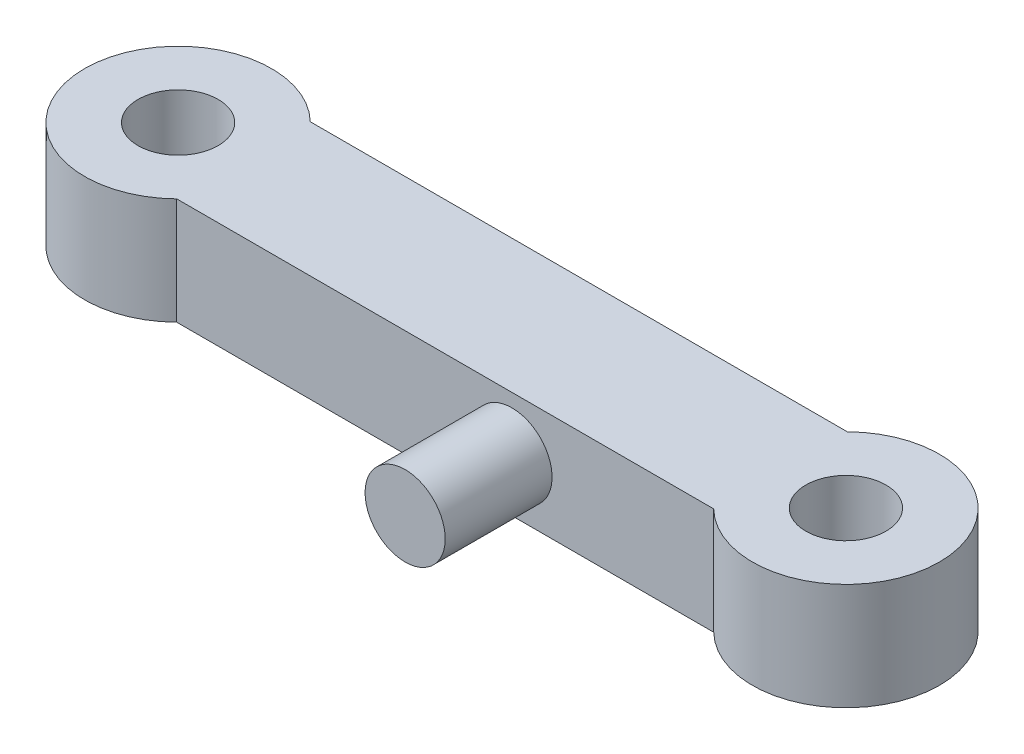
ISO-10303-21;
HEADER;
FILE_DESCRIPTION(('STEP AP214'),'2;1');
FILE_NAME('part.step','',(''),(''),'','','');
FILE_SCHEMA(('AUTOMOTIVE_DESIGN { 1 0 10303 214 1 1 1 1 }'));
ENDSEC;
DATA;
#1=APPLICATION_CONTEXT('core data for automotive mechanical design processes');
#2=APPLICATION_PROTOCOL_DEFINITION('international standard','automotive_design',2000,#1);
#3=PRODUCT_CONTEXT('',#1,'mechanical');
#4=PRODUCT('Part','Part','',(#3));
#5=PRODUCT_RELATED_PRODUCT_CATEGORY('part','',(#4));
#6=PRODUCT_DEFINITION_FORMATION('','',#4);
#7=PRODUCT_DEFINITION_CONTEXT('part definition',#1,'design');
#8=PRODUCT_DEFINITION('design','',#6,#7);
#9=PRODUCT_DEFINITION_SHAPE('','',#8);
#10=(LENGTH_UNIT() NAMED_UNIT(*) SI_UNIT(.MILLI.,.METRE.));
#11=(NAMED_UNIT(*) PLANE_ANGLE_UNIT() SI_UNIT($,.RADIAN.));
#12=(NAMED_UNIT(*) SI_UNIT($,.STERADIAN.) SOLID_ANGLE_UNIT());
#13=UNCERTAINTY_MEASURE_WITH_UNIT(LENGTH_MEASURE(1.E-05),#10,'distance_accuracy_value','');
#14=(GEOMETRIC_REPRESENTATION_CONTEXT(3) GLOBAL_UNCERTAINTY_ASSIGNED_CONTEXT((#13)) GLOBAL_UNIT_ASSIGNED_CONTEXT((#10,
#11,#12)) REPRESENTATION_CONTEXT('',''));
#15=CARTESIAN_POINT('',(0.,0.,0.));
#16=DIRECTION('',(0.,0.,1.));
#17=DIRECTION('',(1.,0.,0.));
#18=AXIS2_PLACEMENT_3D('',#15,#16,#17);
#19=CARTESIAN_POINT('',(12.5,4.,0.));
#20=DIRECTION('',(0.,-1.,0.));
#21=DIRECTION('',(0.,0.,-1.));
#22=AXIS2_PLACEMENT_3D('',#19,#20,#21);
#23=PLANE('',#22);
#24=CARTESIAN_POINT('',(12.5,4.,0.));
#25=DIRECTION('',(0.,1.,0.));
#26=DIRECTION('',(0.,0.,-1.));
#27=AXIS2_PLACEMENT_3D('',#24,#25,#26);
#28=CIRCLE('',#27,3.5);
#29=CARTESIAN_POINT('',(10.0505102572168,4.,2.5));
#30=VERTEX_POINT('',#29);
#31=CARTESIAN_POINT('',(10.0505102572168,4.,-2.5));
#32=VERTEX_POINT('',#31);
#33=EDGE_CURVE('E94',#30,#32,#28,.T.);
#34=ORIENTED_EDGE('',*,*,#33,.T.);
#35=DIRECTION('',(-1.,0.,0.));
#36=VECTOR('',#35,1.);
#37=CARTESIAN_POINT('',(-10.0505102572168,4.,-2.5));
#38=LINE('',#37,#36);
#39=CARTESIAN_POINT('',(-10.0505102572168,4.,-2.5));
#40=VERTEX_POINT('',#39);
#41=EDGE_CURVE('E89',#32,#40,#38,.T.);
#42=ORIENTED_EDGE('',*,*,#41,.T.);
#43=CARTESIAN_POINT('',(-12.5,4.,0.));
#44=DIRECTION('',(0.,1.,0.));
#45=DIRECTION('',(0.,0.,-1.));
#46=AXIS2_PLACEMENT_3D('',#43,#44,#45);
#47=CIRCLE('',#46,3.5);
#48=CARTESIAN_POINT('',(-10.0505102572168,4.,2.5));
#49=VERTEX_POINT('',#48);
#50=EDGE_CURVE('E92',#40,#49,#47,.T.);
#51=ORIENTED_EDGE('',*,*,#50,.T.);
#52=DIRECTION('',(1.,0.,0.));
#53=VECTOR('',#52,1.);
#54=CARTESIAN_POINT('',(-10.0505102572168,4.,2.5));
#55=LINE('',#54,#53);
#56=EDGE_CURVE('E58',#49,#30,#55,.T.);
#57=ORIENTED_EDGE('',*,*,#56,.T.);
#58=EDGE_LOOP('',(#34,#42,#51,#57));
#59=FACE_BOUND('',#58,.T.);
#60=CARTESIAN_POINT('',(12.5,4.,0.));
#61=DIRECTION('',(0.,1.,0.));
#62=DIRECTION('',(0.,0.,1.));
#63=AXIS2_PLACEMENT_3D('',#60,#61,#62);
#64=CIRCLE('',#63,1.5);
#65=CARTESIAN_POINT('',(12.5,4.,1.5));
#66=VERTEX_POINT('',#65);
#67=EDGE_CURVE('E111',#66,#66,#64,.T.);
#68=ORIENTED_EDGE('',*,*,#67,.F.);
#69=EDGE_LOOP('',(#68));
#70=FACE_BOUND('',#69,.T.);
#71=CARTESIAN_POINT('',(-12.5,4.,0.));
#72=DIRECTION('',(0.,1.,0.));
#73=DIRECTION('',(0.,0.,1.));
#74=AXIS2_PLACEMENT_3D('',#71,#72,#73);
#75=CIRCLE('',#74,1.5);
#76=CARTESIAN_POINT('',(-12.5,4.,1.5));
#77=VERTEX_POINT('',#76);
#78=EDGE_CURVE('E128',#77,#77,#75,.T.);
#79=ORIENTED_EDGE('',*,*,#78,.F.);
#80=EDGE_LOOP('',(#79));
#81=FACE_BOUND('',#80,.T.);
#82=ADVANCED_FACE('F41',(#59,#70,#81),#23,.F.);
#83=CARTESIAN_POINT('',(12.5,0.,0.));
#84=DIRECTION('',(0.,-1.,0.));
#85=DIRECTION('',(0.,0.,-1.));
#86=AXIS2_PLACEMENT_3D('',#83,#84,#85);
#87=PLANE('',#86);
#88=CARTESIAN_POINT('',(12.5,0.,0.));
#89=DIRECTION('',(0.,1.,0.));
#90=DIRECTION('',(0.,0.,1.));
#91=AXIS2_PLACEMENT_3D('',#88,#89,#90);
#92=CIRCLE('',#91,1.5);
#93=CARTESIAN_POINT('',(12.5,0.,1.5));
#94=VERTEX_POINT('',#93);
#95=EDGE_CURVE('E132',#94,#94,#92,.T.);
#96=ORIENTED_EDGE('',*,*,#95,.T.);
#97=EDGE_LOOP('',(#96));
#98=FACE_BOUND('',#97,.T.);
#99=CARTESIAN_POINT('',(12.5,0.,0.));
#100=DIRECTION('',(0.,1.,0.));
#101=DIRECTION('',(0.,0.,-1.));
#102=AXIS2_PLACEMENT_3D('',#99,#100,#101);
#103=CIRCLE('',#102,3.5);
#104=CARTESIAN_POINT('',(10.0505102572168,0.,2.5));
#105=VERTEX_POINT('',#104);
#106=CARTESIAN_POINT('',(10.0505102572168,0.,-2.5));
#107=VERTEX_POINT('',#106);
#108=EDGE_CURVE('E108',#105,#107,#103,.T.);
#109=ORIENTED_EDGE('',*,*,#108,.F.);
#110=DIRECTION('',(1.,0.,0.));
#111=VECTOR('',#110,1.);
#112=CARTESIAN_POINT('',(-10.0505102572168,0.,2.5));
#113=LINE('',#112,#111);
#114=CARTESIAN_POINT('',(-10.0505102572168,0.,2.5));
#115=VERTEX_POINT('',#114);
#116=EDGE_CURVE('E81',#115,#105,#113,.T.);
#117=ORIENTED_EDGE('',*,*,#116,.F.);
#118=CARTESIAN_POINT('',(-12.5,0.,0.));
#119=DIRECTION('',(0.,1.,0.));
#120=DIRECTION('',(0.,0.,-1.));
#121=AXIS2_PLACEMENT_3D('',#118,#119,#120);
#122=CIRCLE('',#121,3.5);
#123=CARTESIAN_POINT('',(-10.0505102572168,0.,-2.5));
#124=VERTEX_POINT('',#123);
#125=EDGE_CURVE('E75',#124,#115,#122,.T.);
#126=ORIENTED_EDGE('',*,*,#125,.F.);
#127=DIRECTION('',(-1.,0.,0.));
#128=VECTOR('',#127,1.);
#129=CARTESIAN_POINT('',(-10.0505102572168,0.,-2.5));
#130=LINE('',#129,#128);
#131=EDGE_CURVE('E99',#107,#124,#130,.T.);
#132=ORIENTED_EDGE('',*,*,#131,.F.);
#133=EDGE_LOOP('',(#109,#117,#126,#132));
#134=FACE_BOUND('',#133,.T.);
#135=CARTESIAN_POINT('',(-12.5,0.,0.));
#136=DIRECTION('',(0.,1.,0.));
#137=DIRECTION('',(0.,0.,1.));
#138=AXIS2_PLACEMENT_3D('',#135,#136,#137);
#139=CIRCLE('',#138,1.5);
#140=CARTESIAN_POINT('',(-12.5,0.,1.5));
#141=VERTEX_POINT('',#140);
#142=EDGE_CURVE('E126',#141,#141,#139,.T.);
#143=ORIENTED_EDGE('',*,*,#142,.T.);
#144=EDGE_LOOP('',(#143));
#145=FACE_BOUND('',#144,.T.);
#146=ADVANCED_FACE('F119',(#98,#134,#145),#87,.T.);
#147=CARTESIAN_POINT('',(12.5,4.,0.));
#148=DIRECTION('',(0.,-1.,0.));
#149=DIRECTION('',(0.,0.,-1.));
#150=AXIS2_PLACEMENT_3D('',#147,#148,#149);
#151=CYLINDRICAL_SURFACE('',#150,3.5);
#152=ORIENTED_EDGE('',*,*,#108,.T.);
#153=DIRECTION('',(0.,-1.,0.));
#154=VECTOR('',#153,1.);
#155=CARTESIAN_POINT('',(10.0505102572168,4.,-2.5));
#156=LINE('',#155,#154);
#157=EDGE_CURVE('E50',#32,#107,#156,.T.);
#158=ORIENTED_EDGE('',*,*,#157,.F.);
#159=ORIENTED_EDGE('',*,*,#33,.F.);
#160=DIRECTION('',(0.,-1.,0.));
#161=VECTOR('',#160,1.);
#162=CARTESIAN_POINT('',(10.0505102572168,4.,2.5));
#163=LINE('',#162,#161);
#164=EDGE_CURVE('E104',#30,#105,#163,.T.);
#165=ORIENTED_EDGE('',*,*,#164,.T.);
#166=EDGE_LOOP('',(#152,#158,#159,#165));
#167=FACE_BOUND('',#166,.T.);
#168=ADVANCED_FACE('F43',(#167),#151,.T.);
#169=CARTESIAN_POINT('',(-10.0505102572168,4.,-2.5));
#170=DIRECTION('',(0.,0.,1.));
#171=DIRECTION('',(1.,0.,0.));
#172=AXIS2_PLACEMENT_3D('',#169,#170,#171);
#173=PLANE('',#172);
#174=ORIENTED_EDGE('',*,*,#131,.T.);
#175=DIRECTION('',(0.,-1.,0.));
#176=VECTOR('',#175,1.);
#177=CARTESIAN_POINT('',(-10.0505102572168,4.,-2.5));
#178=LINE('',#177,#176);
#179=EDGE_CURVE('E97',#40,#124,#178,.T.);
#180=ORIENTED_EDGE('',*,*,#179,.F.);
#181=ORIENTED_EDGE('',*,*,#41,.F.);
#182=ORIENTED_EDGE('',*,*,#157,.T.);
#183=EDGE_LOOP('',(#174,#180,#181,#182));
#184=FACE_BOUND('',#183,.T.);
#185=ADVANCED_FACE('F98',(#184),#173,.F.);
#186=CARTESIAN_POINT('',(-12.5,4.,0.));
#187=DIRECTION('',(0.,-1.,0.));
#188=DIRECTION('',(0.,0.,-1.));
#189=AXIS2_PLACEMENT_3D('',#186,#187,#188);
#190=CYLINDRICAL_SURFACE('',#189,3.5);
#191=ORIENTED_EDGE('',*,*,#125,.T.);
#192=DIRECTION('',(0.,-1.,0.));
#193=VECTOR('',#192,1.);
#194=CARTESIAN_POINT('',(-10.0505102572168,4.,2.5));
#195=LINE('',#194,#193);
#196=EDGE_CURVE('E100',#49,#115,#195,.T.);
#197=ORIENTED_EDGE('',*,*,#196,.F.);
#198=ORIENTED_EDGE('',*,*,#50,.F.);
#199=ORIENTED_EDGE('',*,*,#179,.T.);
#200=EDGE_LOOP('',(#191,#197,#198,#199));
#201=FACE_BOUND('',#200,.T.);
#202=ADVANCED_FACE('F102',(#201),#190,.T.);
#203=CARTESIAN_POINT('',(-10.0505102572168,4.,2.5));
#204=DIRECTION('',(0.,0.,-1.));
#205=DIRECTION('',(-1.,0.,0.));
#206=AXIS2_PLACEMENT_3D('',#203,#204,#205);
#207=PLANE('',#206);
#208=CARTESIAN_POINT('',(2.49999999999995,2.,2.5));
#209=DIRECTION('',(0.,0.,-1.));
#210=DIRECTION('',(-1.,0.,0.));
#211=AXIS2_PLACEMENT_3D('',#208,#209,#210);
#212=CIRCLE('',#211,1.5);
#213=CARTESIAN_POINT('',(0.999999999999946,2.,2.5));
#214=VERTEX_POINT('',#213);
#215=EDGE_CURVE('E11',#214,#214,#212,.F.);
#216=ORIENTED_EDGE('',*,*,#215,.F.);
#217=EDGE_LOOP('',(#216));
#218=FACE_BOUND('',#217,.T.);
#219=ORIENTED_EDGE('',*,*,#116,.T.);
#220=ORIENTED_EDGE('',*,*,#164,.F.);
#221=ORIENTED_EDGE('',*,*,#56,.F.);
#222=ORIENTED_EDGE('',*,*,#196,.T.);
#223=EDGE_LOOP('',(#219,#220,#221,#222));
#224=FACE_BOUND('',#223,.T.);
#225=ADVANCED_FACE('F145',(#218,#224),#207,.F.);
#226=CARTESIAN_POINT('',(12.5,4.,0.));
#227=DIRECTION('',(0.,-1.,0.));
#228=DIRECTION('',(0.,0.,-1.));
#229=AXIS2_PLACEMENT_3D('',#226,#227,#228);
#230=CYLINDRICAL_SURFACE('',#229,1.5);
#231=ORIENTED_EDGE('',*,*,#67,.T.);
#232=EDGE_LOOP('',(#231));
#233=FACE_BOUND('',#232,.T.);
#234=ORIENTED_EDGE('',*,*,#95,.F.);
#235=EDGE_LOOP('',(#234));
#236=FACE_BOUND('',#235,.T.);
#237=ADVANCED_FACE('F142',(#233,#236),#230,.F.);
#238=CARTESIAN_POINT('',(-12.5,4.,0.));
#239=DIRECTION('',(0.,-1.,0.));
#240=DIRECTION('',(0.,0.,-1.));
#241=AXIS2_PLACEMENT_3D('',#238,#239,#240);
#242=CYLINDRICAL_SURFACE('',#241,1.5);
#243=ORIENTED_EDGE('',*,*,#78,.T.);
#244=EDGE_LOOP('',(#243));
#245=FACE_BOUND('',#244,.T.);
#246=ORIENTED_EDGE('',*,*,#142,.F.);
#247=EDGE_LOOP('',(#246));
#248=FACE_BOUND('',#247,.T.);
#249=ADVANCED_FACE('F144',(#245,#248),#242,.F.);
#250=CARTESIAN_POINT('',(2.49999999999995,2.,6.5));
#251=DIRECTION('',(0.,0.,-1.));
#252=DIRECTION('',(-1.,0.,0.));
#253=AXIS2_PLACEMENT_3D('',#250,#251,#252);
#254=CYLINDRICAL_SURFACE('',#253,1.5);
#255=CARTESIAN_POINT('',(2.49999999999995,2.,6.5));
#256=DIRECTION('',(0.,0.,1.));
#257=DIRECTION('',(1.,0.,0.));
#258=AXIS2_PLACEMENT_3D('',#255,#256,#257);
#259=CIRCLE('',#258,1.5);
#260=CARTESIAN_POINT('',(3.99999999999995,2.,6.5));
#261=VERTEX_POINT('',#260);
#262=EDGE_CURVE('E129',#261,#261,#259,.T.);
#263=ORIENTED_EDGE('',*,*,#262,.F.);
#264=EDGE_LOOP('',(#263));
#265=FACE_BOUND('',#264,.T.);
#266=ORIENTED_EDGE('',*,*,#215,.T.);
#267=EDGE_LOOP('',(#266));
#268=FACE_BOUND('',#267,.T.);
#269=ADVANCED_FACE('F152',(#265,#268),#254,.T.);
#270=CARTESIAN_POINT('',(2.49999999999995,2.,6.5));
#271=DIRECTION('',(0.,0.,1.));
#272=DIRECTION('',(1.,0.,0.));
#273=AXIS2_PLACEMENT_3D('',#270,#271,#272);
#274=PLANE('',#273);
#275=ORIENTED_EDGE('',*,*,#262,.T.);
#276=EDGE_LOOP('',(#275));
#277=FACE_BOUND('',#276,.T.);
#278=ADVANCED_FACE('F211',(#277),#274,.T.);
#279=CLOSED_SHELL('',(#82,#146,#168,#185,#202,#225,#237,#249,#269,#278));
#280=MANIFOLD_SOLID_BREP('B2',#279);
#281=ADVANCED_BREP_SHAPE_REPRESENTATION('',(#18,#280),#14);
#282=SHAPE_DEFINITION_REPRESENTATION(#9,#281);
ENDSEC;
END-ISO-10303-21;
